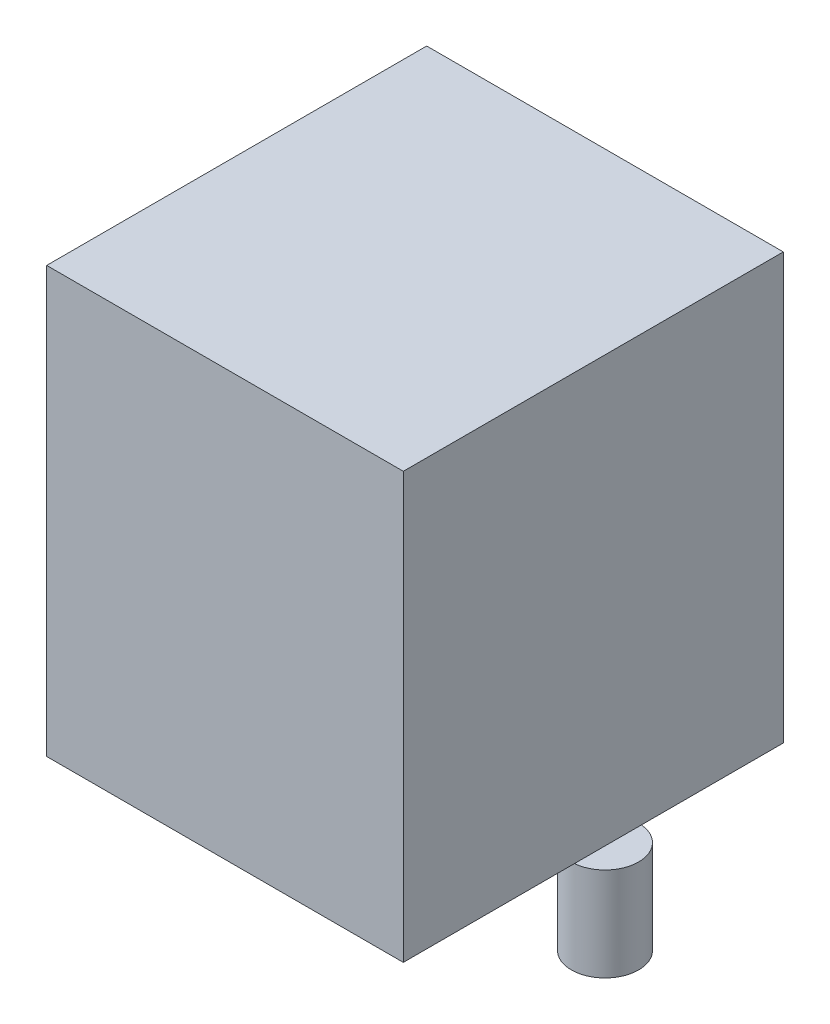
ISO-10303-21;
HEADER;
FILE_DESCRIPTION(('STEP AP214'),'2;1');
FILE_NAME('part.step','',(''),(''),'','','');
FILE_SCHEMA(('AUTOMOTIVE_DESIGN { 1 0 10303 214 1 1 1 1 }'));
ENDSEC;
DATA;
#1=APPLICATION_CONTEXT('core data for automotive mechanical design processes');
#2=APPLICATION_PROTOCOL_DEFINITION('international standard','automotive_design',2000,#1);
#3=PRODUCT_CONTEXT('',#1,'mechanical');
#4=PRODUCT('Part','Part','',(#3));
#5=PRODUCT_RELATED_PRODUCT_CATEGORY('part','',(#4));
#6=PRODUCT_DEFINITION_FORMATION('','',#4);
#7=PRODUCT_DEFINITION_CONTEXT('part definition',#1,'design');
#8=PRODUCT_DEFINITION('design','',#6,#7);
#9=PRODUCT_DEFINITION_SHAPE('','',#8);
#10=(LENGTH_UNIT() NAMED_UNIT(*) SI_UNIT(.MILLI.,.METRE.));
#11=(NAMED_UNIT(*) PLANE_ANGLE_UNIT() SI_UNIT($,.RADIAN.));
#12=(NAMED_UNIT(*) SI_UNIT($,.STERADIAN.) SOLID_ANGLE_UNIT());
#13=UNCERTAINTY_MEASURE_WITH_UNIT(LENGTH_MEASURE(1.E-05),#10,'distance_accuracy_value','');
#14=(GEOMETRIC_REPRESENTATION_CONTEXT(3) GLOBAL_UNCERTAINTY_ASSIGNED_CONTEXT((#13)) GLOBAL_UNIT_ASSIGNED_CONTEXT((#10,
#11,#12)) REPRESENTATION_CONTEXT('',''));
#15=CARTESIAN_POINT('',(0.,0.,0.));
#16=DIRECTION('',(0.,0.,1.));
#17=DIRECTION('',(1.,0.,0.));
#18=AXIS2_PLACEMENT_3D('',#15,#16,#17);
#19=CARTESIAN_POINT('',(-6.,-3.2,0.));
#20=DIRECTION('',(0.,1.,0.));
#21=DIRECTION('',(0.,0.,1.));
#22=AXIS2_PLACEMENT_3D('',#19,#20,#21);
#23=CYLINDRICAL_SURFACE('',#22,1.15);
#24=CARTESIAN_POINT('',(-6.,-3.2,0.));
#25=DIRECTION('',(0.,1.,0.));
#26=DIRECTION('',(0.,0.,1.));
#27=AXIS2_PLACEMENT_3D('',#24,#25,#26);
#28=CIRCLE('',#27,1.15);
#29=CARTESIAN_POINT('',(-6.,-3.2,1.15));
#30=VERTEX_POINT('',#29);
#31=EDGE_CURVE('E41',#30,#30,#28,.T.);
#32=ORIENTED_EDGE('',*,*,#31,.T.);
#33=EDGE_LOOP('',(#32));
#34=FACE_BOUND('',#33,.T.);
#35=CARTESIAN_POINT('',(-6.,0.,0.));
#36=DIRECTION('',(0.,1.,0.));
#37=DIRECTION('',(0.,0.,1.));
#38=AXIS2_PLACEMENT_3D('',#35,#36,#37);
#39=CIRCLE('',#38,1.15);
#40=CARTESIAN_POINT('',(-6.1,0.,-1.14564392373896));
#41=VERTEX_POINT('',#40);
#42=CARTESIAN_POINT('',(-6.1,0.,1.14564392373896));
#43=VERTEX_POINT('',#42);
#44=EDGE_CURVE('E36',#41,#43,#39,.T.);
#45=ORIENTED_EDGE('',*,*,#44,.F.);
#46=EDGE_CURVE('E188',#43,#41,#39,.T.);
#47=ORIENTED_EDGE('',*,*,#46,.F.);
#48=EDGE_LOOP('',(#45,#47));
#49=FACE_BOUND('',#48,.T.);
#50=ADVANCED_FACE('F33',(#34,#49),#23,.T.);
#51=CARTESIAN_POINT('',(0.,-3.2,0.));
#52=DIRECTION('',(0.,1.,0.));
#53=DIRECTION('',(0.,0.,1.));
#54=AXIS2_PLACEMENT_3D('',#51,#52,#53);
#55=PLANE('',#54);
#56=ORIENTED_EDGE('',*,*,#31,.F.);
#57=EDGE_LOOP('',(#56));
#58=FACE_BOUND('',#57,.T.);
#59=ADVANCED_FACE('F238',(#58),#55,.F.);
#60=CARTESIAN_POINT('',(0.,0.,0.));
#61=DIRECTION('',(0.,1.,0.));
#62=DIRECTION('',(0.,0.,1.));
#63=AXIS2_PLACEMENT_3D('',#60,#61,#62);
#64=PLANE('',#63);
#65=DIRECTION('',(0.,0.,1.));
#66=VECTOR('',#65,1.);
#67=CARTESIAN_POINT('',(-6.1,0.,0.));
#68=LINE('',#67,#66);
#69=EDGE_CURVE('E11',#41,#43,#68,.T.);
#70=ORIENTED_EDGE('',*,*,#69,.F.);
#71=ORIENTED_EDGE('',*,*,#44,.T.);
#72=EDGE_LOOP('',(#70,#71));
#73=FACE_BOUND('',#72,.T.);
#74=ADVANCED_FACE('F242',(#73),#64,.T.);
#75=CARTESIAN_POINT('',(0.,0.,0.));
#76=DIRECTION('',(0.,1.,0.));
#77=DIRECTION('',(0.,0.,1.));
#78=AXIS2_PLACEMENT_3D('',#75,#76,#77);
#79=PLANE('',#78);
#80=DIRECTION('',(0.,0.,1.));
#81=VECTOR('',#80,1.);
#82=CARTESIAN_POINT('',(6.1,0.,0.));
#83=LINE('',#82,#81);
#84=CARTESIAN_POINT('',(6.1,0.,-6.));
#85=VERTEX_POINT('',#84);
#86=CARTESIAN_POINT('',(6.1,0.,-1.14564392373896));
#87=VERTEX_POINT('',#86);
#88=EDGE_CURVE('E164',#85,#87,#83,.T.);
#89=ORIENTED_EDGE('',*,*,#88,.T.);
#90=CARTESIAN_POINT('',(6.,0.,0.));
#91=DIRECTION('',(0.,1.,0.));
#92=DIRECTION('',(0.,0.,1.));
#93=AXIS2_PLACEMENT_3D('',#90,#91,#92);
#94=CIRCLE('',#93,1.15);
#95=CARTESIAN_POINT('',(6.1,0.,1.14564392373896));
#96=VERTEX_POINT('',#95);
#97=EDGE_CURVE('E149',#87,#96,#94,.T.);
#98=ORIENTED_EDGE('',*,*,#97,.T.);
#99=CARTESIAN_POINT('',(6.1,0.,7.));
#100=VERTEX_POINT('',#99);
#101=EDGE_CURVE('E178',#96,#100,#83,.T.);
#102=ORIENTED_EDGE('',*,*,#101,.T.);
#103=DIRECTION('',(1.,0.,0.));
#104=VECTOR('',#103,1.);
#105=CARTESIAN_POINT('',(0.,0.,7.));
#106=LINE('',#105,#104);
#107=CARTESIAN_POINT('',(-6.1,0.,7.));
#108=VERTEX_POINT('',#107);
#109=EDGE_CURVE('E175',#108,#100,#106,.T.);
#110=ORIENTED_EDGE('',*,*,#109,.F.);
#111=EDGE_CURVE('E44',#43,#108,#68,.T.);
#112=ORIENTED_EDGE('',*,*,#111,.F.);
#113=ORIENTED_EDGE('',*,*,#46,.T.);
#114=CARTESIAN_POINT('',(-6.1,0.,-6.));
#115=VERTEX_POINT('',#114);
#116=EDGE_CURVE('E43',#115,#41,#68,.T.);
#117=ORIENTED_EDGE('',*,*,#116,.F.);
#118=DIRECTION('',(1.,0.,0.));
#119=VECTOR('',#118,1.);
#120=CARTESIAN_POINT('',(0.,0.,-6.));
#121=LINE('',#120,#119);
#122=EDGE_CURVE('E156',#115,#85,#121,.T.);
#123=ORIENTED_EDGE('',*,*,#122,.T.);
#124=EDGE_LOOP('',(#89,#98,#102,#110,#112,#113,#117,#123));
#125=FACE_BOUND('',#124,.T.);
#126=ADVANCED_FACE('F199',(#125),#79,.F.);
#127=CARTESIAN_POINT('',(0.,14.55,-6.));
#128=DIRECTION('',(0.,0.,-1.));
#129=DIRECTION('',(-1.,0.,0.));
#130=AXIS2_PLACEMENT_3D('',#127,#128,#129);
#131=PLANE('',#130);
#132=DIRECTION('',(0.,-1.,0.));
#133=VECTOR('',#132,1.);
#134=CARTESIAN_POINT('',(4.93829417989418,14.55,-6.));
#135=LINE('',#134,#133);
#136=CARTESIAN_POINT('',(4.93829417989418,13.4375360018403,-6.));
#137=VERTEX_POINT('',#136);
#138=CARTESIAN_POINT('',(4.93829417989418,1.166122705314,-6.));
#139=VERTEX_POINT('',#138);
#140=EDGE_CURVE('E51',#137,#139,#135,.T.);
#141=ORIENTED_EDGE('',*,*,#140,.F.);
#142=DIRECTION('',(1.,0.,0.));
#143=VECTOR('',#142,1.);
#144=CARTESIAN_POINT('',(0.,13.4375360018403,-6.));
#145=LINE('',#144,#143);
#146=CARTESIAN_POINT('',(-4.93829417989418,13.4375360018403,-6.));
#147=VERTEX_POINT('',#146);
#148=EDGE_CURVE('E134',#147,#137,#145,.T.);
#149=ORIENTED_EDGE('',*,*,#148,.F.);
#150=DIRECTION('',(0.,1.,0.));
#151=VECTOR('',#150,1.);
#152=CARTESIAN_POINT('',(-4.93829417989418,14.55,-6.));
#153=LINE('',#152,#151);
#154=CARTESIAN_POINT('',(-4.93829417989418,1.166122705314,-6.));
#155=VERTEX_POINT('',#154);
#156=EDGE_CURVE('E137',#155,#147,#153,.T.);
#157=ORIENTED_EDGE('',*,*,#156,.F.);
#158=DIRECTION('',(-1.,0.,0.));
#159=VECTOR('',#158,1.);
#160=CARTESIAN_POINT('',(0.,1.166122705314,-6.));
#161=LINE('',#160,#159);
#162=EDGE_CURVE('E143',#139,#155,#161,.T.);
#163=ORIENTED_EDGE('',*,*,#162,.F.);
#164=EDGE_LOOP('',(#141,#149,#157,#163));
#165=FACE_BOUND('',#164,.T.);
#166=ORIENTED_EDGE('',*,*,#122,.F.);
#167=DIRECTION('',(0.,-1.,0.));
#168=VECTOR('',#167,1.);
#169=CARTESIAN_POINT('',(-6.1,14.55,-6.));
#170=LINE('',#169,#168);
#171=CARTESIAN_POINT('',(-6.1,14.55,-6.));
#172=VERTEX_POINT('',#171);
#173=EDGE_CURVE('E187',#172,#115,#170,.T.);
#174=ORIENTED_EDGE('',*,*,#173,.F.);
#175=DIRECTION('',(1.,0.,0.));
#176=VECTOR('',#175,1.);
#177=CARTESIAN_POINT('',(0.,14.55,-6.));
#178=LINE('',#177,#176);
#179=CARTESIAN_POINT('',(6.1,14.55,-6.));
#180=VERTEX_POINT('',#179);
#181=EDGE_CURVE('E160',#172,#180,#178,.T.);
#182=ORIENTED_EDGE('',*,*,#181,.T.);
#183=DIRECTION('',(0.,-1.,0.));
#184=VECTOR('',#183,1.);
#185=CARTESIAN_POINT('',(6.1,14.55,-6.));
#186=LINE('',#185,#184);
#187=EDGE_CURVE('E171',#180,#85,#186,.T.);
#188=ORIENTED_EDGE('',*,*,#187,.T.);
#189=EDGE_LOOP('',(#166,#174,#182,#188));
#190=FACE_BOUND('',#189,.T.);
#191=ADVANCED_FACE('F209',(#165,#190),#131,.T.);
#192=CARTESIAN_POINT('',(-6.1,14.55,0.));
#193=DIRECTION('',(1.,0.,0.));
#194=DIRECTION('',(0.,0.,-1.));
#195=AXIS2_PLACEMENT_3D('',#192,#193,#194);
#196=PLANE('',#195);
#197=ORIENTED_EDGE('',*,*,#116,.T.);
#198=ORIENTED_EDGE('',*,*,#69,.T.);
#199=ORIENTED_EDGE('',*,*,#111,.T.);
#200=DIRECTION('',(0.,-1.,0.));
#201=VECTOR('',#200,1.);
#202=CARTESIAN_POINT('',(-6.1,14.55,7.));
#203=LINE('',#202,#201);
#204=CARTESIAN_POINT('',(-6.1,14.55,7.));
#205=VERTEX_POINT('',#204);
#206=EDGE_CURVE('E184',#205,#108,#203,.T.);
#207=ORIENTED_EDGE('',*,*,#206,.F.);
#208=DIRECTION('',(0.,0.,1.));
#209=VECTOR('',#208,1.);
#210=CARTESIAN_POINT('',(-6.1,14.55,0.));
#211=LINE('',#210,#209);
#212=EDGE_CURVE('E163',#172,#205,#211,.T.);
#213=ORIENTED_EDGE('',*,*,#212,.F.);
#214=ORIENTED_EDGE('',*,*,#173,.T.);
#215=EDGE_LOOP('',(#197,#198,#199,#207,#213,#214));
#216=FACE_BOUND('',#215,.T.);
#217=ADVANCED_FACE('F204',(#216),#196,.F.);
#218=CARTESIAN_POINT('',(0.,14.55,7.));
#219=DIRECTION('',(0.,0.,-1.));
#220=DIRECTION('',(-1.,0.,0.));
#221=AXIS2_PLACEMENT_3D('',#218,#219,#220);
#222=PLANE('',#221);
#223=ORIENTED_EDGE('',*,*,#109,.T.);
#224=DIRECTION('',(0.,-1.,0.));
#225=VECTOR('',#224,1.);
#226=CARTESIAN_POINT('',(6.1,14.55,7.));
#227=LINE('',#226,#225);
#228=CARTESIAN_POINT('',(6.1,14.55,7.));
#229=VERTEX_POINT('',#228);
#230=EDGE_CURVE('E181',#229,#100,#227,.T.);
#231=ORIENTED_EDGE('',*,*,#230,.F.);
#232=DIRECTION('',(1.,0.,0.));
#233=VECTOR('',#232,1.);
#234=CARTESIAN_POINT('',(0.,14.55,7.));
#235=LINE('',#234,#233);
#236=EDGE_CURVE('E166',#205,#229,#235,.T.);
#237=ORIENTED_EDGE('',*,*,#236,.F.);
#238=ORIENTED_EDGE('',*,*,#206,.T.);
#239=EDGE_LOOP('',(#223,#231,#237,#238));
#240=FACE_BOUND('',#239,.T.);
#241=ADVANCED_FACE('F219',(#240),#222,.F.);
#242=CARTESIAN_POINT('',(6.1,14.55,0.));
#243=DIRECTION('',(1.,0.,0.));
#244=DIRECTION('',(0.,0.,-1.));
#245=AXIS2_PLACEMENT_3D('',#242,#243,#244);
#246=PLANE('',#245);
#247=ORIENTED_EDGE('',*,*,#88,.F.);
#248=ORIENTED_EDGE('',*,*,#187,.F.);
#249=DIRECTION('',(0.,0.,1.));
#250=VECTOR('',#249,1.);
#251=CARTESIAN_POINT('',(6.1,14.55,0.));
#252=LINE('',#251,#250);
#253=EDGE_CURVE('E168',#180,#229,#252,.T.);
#254=ORIENTED_EDGE('',*,*,#253,.T.);
#255=ORIENTED_EDGE('',*,*,#230,.T.);
#256=ORIENTED_EDGE('',*,*,#101,.F.);
#257=EDGE_CURVE('E59',#87,#96,#83,.T.);
#258=ORIENTED_EDGE('',*,*,#257,.F.);
#259=EDGE_LOOP('',(#247,#248,#254,#255,#256,#258));
#260=FACE_BOUND('',#259,.T.);
#261=ADVANCED_FACE('F213',(#260),#246,.T.);
#262=CARTESIAN_POINT('',(0.,14.55,0.));
#263=DIRECTION('',(0.,1.,0.));
#264=DIRECTION('',(0.,0.,1.));
#265=AXIS2_PLACEMENT_3D('',#262,#263,#264);
#266=PLANE('',#265);
#267=ORIENTED_EDGE('',*,*,#181,.F.);
#268=ORIENTED_EDGE('',*,*,#212,.T.);
#269=ORIENTED_EDGE('',*,*,#236,.T.);
#270=ORIENTED_EDGE('',*,*,#253,.F.);
#271=EDGE_LOOP('',(#267,#268,#269,#270));
#272=FACE_BOUND('',#271,.T.);
#273=ADVANCED_FACE('F216',(#272),#266,.T.);
#274=CARTESIAN_POINT('',(6.,-3.2,0.));
#275=DIRECTION('',(0.,1.,0.));
#276=DIRECTION('',(0.,0.,1.));
#277=AXIS2_PLACEMENT_3D('',#274,#275,#276);
#278=CYLINDRICAL_SURFACE('',#277,1.15);
#279=CARTESIAN_POINT('',(6.,-3.2,0.));
#280=DIRECTION('',(0.,1.,0.));
#281=DIRECTION('',(0.,0.,1.));
#282=AXIS2_PLACEMENT_3D('',#279,#280,#281);
#283=CIRCLE('',#282,1.15);
#284=CARTESIAN_POINT('',(6.,-3.2,1.15));
#285=VERTEX_POINT('',#284);
#286=EDGE_CURVE('E153',#285,#285,#283,.T.);
#287=ORIENTED_EDGE('',*,*,#286,.T.);
#288=EDGE_LOOP('',(#287));
#289=FACE_BOUND('',#288,.T.);
#290=EDGE_CURVE('E157',#96,#87,#94,.T.);
#291=ORIENTED_EDGE('',*,*,#290,.F.);
#292=ORIENTED_EDGE('',*,*,#97,.F.);
#293=EDGE_LOOP('',(#291,#292));
#294=FACE_BOUND('',#293,.T.);
#295=ADVANCED_FACE('F224',(#289,#294),#278,.T.);
#296=CARTESIAN_POINT('',(0.,-3.2,0.));
#297=DIRECTION('',(0.,1.,0.));
#298=DIRECTION('',(0.,0.,1.));
#299=AXIS2_PLACEMENT_3D('',#296,#297,#298);
#300=PLANE('',#299);
#301=ORIENTED_EDGE('',*,*,#286,.F.);
#302=EDGE_LOOP('',(#301));
#303=FACE_BOUND('',#302,.T.);
#304=ADVANCED_FACE('F226',(#303),#300,.F.);
#305=CARTESIAN_POINT('',(0.,0.,0.));
#306=DIRECTION('',(0.,1.,0.));
#307=DIRECTION('',(0.,0.,1.));
#308=AXIS2_PLACEMENT_3D('',#305,#306,#307);
#309=PLANE('',#308);
#310=ORIENTED_EDGE('',*,*,#290,.T.);
#311=ORIENTED_EDGE('',*,*,#257,.T.);
#312=EDGE_LOOP('',(#310,#311));
#313=FACE_BOUND('',#312,.T.);
#314=ADVANCED_FACE('F222',(#313),#309,.T.);
#315=CARTESIAN_POINT('',(4.93829417989418,14.55,-4.));
#316=DIRECTION('',(1.,0.,0.));
#317=DIRECTION('',(0.,0.,-1.));
#318=AXIS2_PLACEMENT_3D('',#315,#316,#317);
#319=PLANE('',#318);
#320=ORIENTED_EDGE('',*,*,#140,.T.);
#321=DIRECTION('',(0.,0.,-1.));
#322=VECTOR('',#321,1.);
#323=CARTESIAN_POINT('',(4.93829417989418,1.166122705314,-4.));
#324=LINE('',#323,#322);
#325=CARTESIAN_POINT('',(4.93829417989418,1.166122705314,-4.));
#326=VERTEX_POINT('',#325);
#327=EDGE_CURVE('E112',#326,#139,#324,.T.);
#328=ORIENTED_EDGE('',*,*,#327,.F.);
#329=DIRECTION('',(0.,-1.,0.));
#330=VECTOR('',#329,1.);
#331=CARTESIAN_POINT('',(4.93829417989418,14.55,-4.));
#332=LINE('',#331,#330);
#333=CARTESIAN_POINT('',(4.93829417989418,13.4375360018403,-4.));
#334=VERTEX_POINT('',#333);
#335=EDGE_CURVE('E116',#334,#326,#332,.T.);
#336=ORIENTED_EDGE('',*,*,#335,.F.);
#337=DIRECTION('',(0.,0.,-1.));
#338=VECTOR('',#337,1.);
#339=CARTESIAN_POINT('',(4.93829417989418,13.4375360018403,-4.));
#340=LINE('',#339,#338);
#341=EDGE_CURVE('E147',#334,#137,#340,.T.);
#342=ORIENTED_EDGE('',*,*,#341,.T.);
#343=EDGE_LOOP('',(#320,#328,#336,#342));
#344=FACE_BOUND('',#343,.T.);
#345=ADVANCED_FACE('F114',(#344),#319,.F.);
#346=CARTESIAN_POINT('',(0.,13.4375360018403,-4.));
#347=DIRECTION('',(0.,1.,0.));
#348=DIRECTION('',(0.,0.,1.));
#349=AXIS2_PLACEMENT_3D('',#346,#347,#348);
#350=PLANE('',#349);
#351=ORIENTED_EDGE('',*,*,#148,.T.);
#352=ORIENTED_EDGE('',*,*,#341,.F.);
#353=DIRECTION('',(1.,0.,0.));
#354=VECTOR('',#353,1.);
#355=CARTESIAN_POINT('',(0.,13.4375360018403,-4.));
#356=LINE('',#355,#354);
#357=CARTESIAN_POINT('',(-4.93829417989418,13.4375360018403,-4.));
#358=VERTEX_POINT('',#357);
#359=EDGE_CURVE('E122',#358,#334,#356,.T.);
#360=ORIENTED_EDGE('',*,*,#359,.F.);
#361=DIRECTION('',(0.,0.,-1.));
#362=VECTOR('',#361,1.);
#363=CARTESIAN_POINT('',(-4.93829417989418,13.4375360018403,-4.));
#364=LINE('',#363,#362);
#365=EDGE_CURVE('E150',#358,#147,#364,.T.);
#366=ORIENTED_EDGE('',*,*,#365,.T.);
#367=EDGE_LOOP('',(#351,#352,#360,#366));
#368=FACE_BOUND('',#367,.T.);
#369=ADVANCED_FACE('F313',(#368),#350,.F.);
#370=CARTESIAN_POINT('',(-4.93829417989418,14.55,-4.));
#371=DIRECTION('',(-1.,0.,0.));
#372=DIRECTION('',(0.,0.,1.));
#373=AXIS2_PLACEMENT_3D('',#370,#371,#372);
#374=PLANE('',#373);
#375=ORIENTED_EDGE('',*,*,#156,.T.);
#376=ORIENTED_EDGE('',*,*,#365,.F.);
#377=DIRECTION('',(0.,1.,0.));
#378=VECTOR('',#377,1.);
#379=CARTESIAN_POINT('',(-4.93829417989418,14.55,-4.));
#380=LINE('',#379,#378);
#381=CARTESIAN_POINT('',(-4.93829417989418,1.166122705314,-4.));
#382=VERTEX_POINT('',#381);
#383=EDGE_CURVE('E130',#382,#358,#380,.T.);
#384=ORIENTED_EDGE('',*,*,#383,.F.);
#385=DIRECTION('',(0.,0.,-1.));
#386=VECTOR('',#385,1.);
#387=CARTESIAN_POINT('',(-4.93829417989418,1.166122705314,-4.));
#388=LINE('',#387,#386);
#389=EDGE_CURVE('E121',#382,#155,#388,.T.);
#390=ORIENTED_EDGE('',*,*,#389,.T.);
#391=EDGE_LOOP('',(#375,#376,#384,#390));
#392=FACE_BOUND('',#391,.T.);
#393=ADVANCED_FACE('F319',(#392),#374,.F.);
#394=CARTESIAN_POINT('',(0.,1.166122705314,-4.));
#395=DIRECTION('',(0.,-1.,0.));
#396=DIRECTION('',(1.,0.,0.));
#397=AXIS2_PLACEMENT_3D('',#394,#395,#396);
#398=PLANE('',#397);
#399=ORIENTED_EDGE('',*,*,#162,.T.);
#400=ORIENTED_EDGE('',*,*,#389,.F.);
#401=DIRECTION('',(-1.,0.,0.));
#402=VECTOR('',#401,1.);
#403=CARTESIAN_POINT('',(0.,1.166122705314,-4.));
#404=LINE('',#403,#402);
#405=EDGE_CURVE('E125',#326,#382,#404,.T.);
#406=ORIENTED_EDGE('',*,*,#405,.F.);
#407=ORIENTED_EDGE('',*,*,#327,.T.);
#408=EDGE_LOOP('',(#399,#400,#406,#407));
#409=FACE_BOUND('',#408,.T.);
#410=ADVANCED_FACE('F126',(#409),#398,.F.);
#411=CARTESIAN_POINT('',(0.,0.,-4.));
#412=DIRECTION('',(0.,0.,-1.));
#413=DIRECTION('',(-1.,0.,0.));
#414=AXIS2_PLACEMENT_3D('',#411,#412,#413);
#415=PLANE('',#414);
#416=ORIENTED_EDGE('',*,*,#335,.T.);
#417=ORIENTED_EDGE('',*,*,#405,.T.);
#418=ORIENTED_EDGE('',*,*,#383,.T.);
#419=ORIENTED_EDGE('',*,*,#359,.T.);
#420=EDGE_LOOP('',(#416,#417,#418,#419));
#421=FACE_BOUND('',#420,.T.);
#422=ADVANCED_FACE('F132',(#421),#415,.T.);
#423=CLOSED_SHELL('',(#50,#59,#74,#126,#191,#217,#241,#261,#273,#295,#304,#314,#345,#369,#393,
#410,#422));
#424=MANIFOLD_SOLID_BREP('B2',#423);
#425=ADVANCED_BREP_SHAPE_REPRESENTATION('',(#18,#424),#14);
#426=SHAPE_DEFINITION_REPRESENTATION(#9,#425);
ENDSEC;
END-ISO-10303-21;
